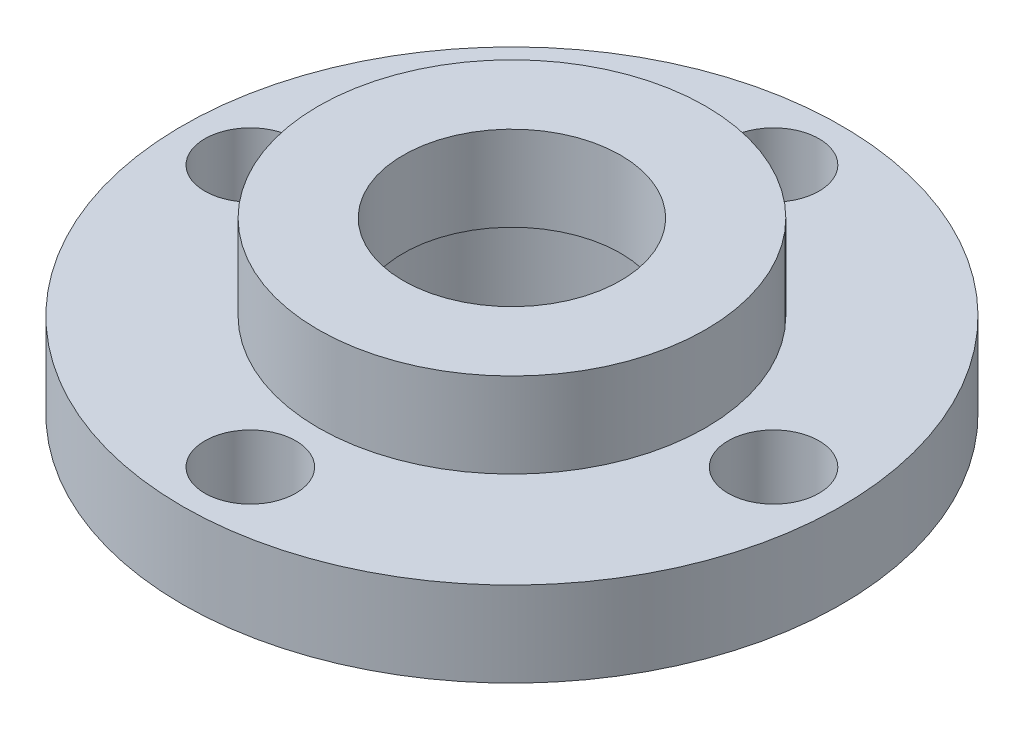
ISO-10303-21;
HEADER;
FILE_DESCRIPTION(('STEP AP214'),'2;1');
FILE_NAME('part.step','',(''),(''),'','','');
FILE_SCHEMA(('AUTOMOTIVE_DESIGN { 1 0 10303 214 1 1 1 1 }'));
ENDSEC;
DATA;
#1=APPLICATION_CONTEXT('core data for automotive mechanical design processes');
#2=APPLICATION_PROTOCOL_DEFINITION('international standard','automotive_design',2000,#1);
#3=PRODUCT_CONTEXT('',#1,'mechanical');
#4=PRODUCT('Part','Part','',(#3));
#5=PRODUCT_RELATED_PRODUCT_CATEGORY('part','',(#4));
#6=PRODUCT_DEFINITION_FORMATION('','',#4);
#7=PRODUCT_DEFINITION_CONTEXT('part definition',#1,'design');
#8=PRODUCT_DEFINITION('design','',#6,#7);
#9=PRODUCT_DEFINITION_SHAPE('','',#8);
#10=(LENGTH_UNIT() NAMED_UNIT(*) SI_UNIT(.MILLI.,.METRE.));
#11=(NAMED_UNIT(*) PLANE_ANGLE_UNIT() SI_UNIT($,.RADIAN.));
#12=(NAMED_UNIT(*) SI_UNIT($,.STERADIAN.) SOLID_ANGLE_UNIT());
#13=UNCERTAINTY_MEASURE_WITH_UNIT(LENGTH_MEASURE(1.E-05),#10,'distance_accuracy_value','');
#14=(GEOMETRIC_REPRESENTATION_CONTEXT(3) GLOBAL_UNCERTAINTY_ASSIGNED_CONTEXT((#13)) GLOBAL_UNIT_ASSIGNED_CONTEXT((#10,
#11,#12)) REPRESENTATION_CONTEXT('',''));
#15=CARTESIAN_POINT('',(0.,0.,0.));
#16=DIRECTION('',(0.,0.,1.));
#17=DIRECTION('',(1.,0.,0.));
#18=AXIS2_PLACEMENT_3D('',#15,#16,#17);
#19=CARTESIAN_POINT('',(0.,6.35,0.));
#20=DIRECTION('',(0.,-1.,0.));
#21=DIRECTION('',(0.,0.,-1.));
#22=AXIS2_PLACEMENT_3D('',#19,#20,#21);
#23=CYLINDRICAL_SURFACE('',#22,4.064);
#24=CARTESIAN_POINT('',(0.,6.35,0.));
#25=DIRECTION('',(0.,1.,0.));
#26=DIRECTION('',(0.,0.,1.));
#27=AXIS2_PLACEMENT_3D('',#24,#25,#26);
#28=CIRCLE('',#27,4.064);
#29=CARTESIAN_POINT('',(0.,6.35,4.064));
#30=VERTEX_POINT('',#29);
#31=EDGE_CURVE('E53',#30,#30,#28,.T.);
#32=ORIENTED_EDGE('',*,*,#31,.T.);
#33=EDGE_LOOP('',(#32));
#34=FACE_BOUND('',#33,.T.);
#35=CARTESIAN_POINT('',(0.,3.175,0.));
#36=DIRECTION('',(0.,-1.,0.));
#37=DIRECTION('',(0.,0.,-1.));
#38=AXIS2_PLACEMENT_3D('',#35,#36,#37);
#39=CIRCLE('',#38,4.064);
#40=CARTESIAN_POINT('',(0.,3.175,-4.064));
#41=VERTEX_POINT('',#40);
#42=EDGE_CURVE('E48',#41,#41,#39,.T.);
#43=ORIENTED_EDGE('',*,*,#42,.T.);
#44=EDGE_LOOP('',(#43));
#45=FACE_BOUND('',#44,.T.);
#46=ADVANCED_FACE('F45',(#34,#45),#23,.F.);
#47=CARTESIAN_POINT('',(0.,6.35,0.));
#48=DIRECTION('',(0.,-1.,0.));
#49=DIRECTION('',(0.,0.,-1.));
#50=AXIS2_PLACEMENT_3D('',#47,#48,#49);
#51=CYLINDRICAL_SURFACE('',#50,7.239);
#52=CARTESIAN_POINT('',(0.,3.175,0.));
#53=DIRECTION('',(0.,1.,0.));
#54=DIRECTION('',(0.,0.,1.));
#55=AXIS2_PLACEMENT_3D('',#52,#53,#54);
#56=CIRCLE('',#55,7.239);
#57=CARTESIAN_POINT('',(0.,3.175,7.239));
#58=VERTEX_POINT('',#57);
#59=EDGE_CURVE('E65',#58,#58,#56,.T.);
#60=ORIENTED_EDGE('',*,*,#59,.T.);
#61=EDGE_LOOP('',(#60));
#62=FACE_BOUND('',#61,.T.);
#63=CARTESIAN_POINT('',(0.,6.35,0.));
#64=DIRECTION('',(0.,1.,0.));
#65=DIRECTION('',(0.,0.,1.));
#66=AXIS2_PLACEMENT_3D('',#63,#64,#65);
#67=CIRCLE('',#66,7.239);
#68=CARTESIAN_POINT('',(0.,6.35,7.239));
#69=VERTEX_POINT('',#68);
#70=EDGE_CURVE('E10',#69,#69,#67,.T.);
#71=ORIENTED_EDGE('',*,*,#70,.F.);
#72=EDGE_LOOP('',(#71));
#73=FACE_BOUND('',#72,.T.);
#74=ADVANCED_FACE('F129',(#62,#73),#51,.T.);
#75=CARTESIAN_POINT('',(0.,6.35,0.));
#76=DIRECTION('',(0.,1.,0.));
#77=DIRECTION('',(0.,0.,1.));
#78=AXIS2_PLACEMENT_3D('',#75,#76,#77);
#79=PLANE('',#78);
#80=ORIENTED_EDGE('',*,*,#31,.F.);
#81=EDGE_LOOP('',(#80));
#82=FACE_BOUND('',#81,.T.);
#83=ORIENTED_EDGE('',*,*,#70,.T.);
#84=EDGE_LOOP('',(#83));
#85=FACE_BOUND('',#84,.T.);
#86=ADVANCED_FACE('F134',(#82,#85),#79,.T.);
#87=CARTESIAN_POINT('',(0.,0.,0.));
#88=DIRECTION('',(0.,1.,0.));
#89=DIRECTION('',(0.,0.,1.));
#90=AXIS2_PLACEMENT_3D('',#87,#88,#89);
#91=PLANE('',#90);
#92=CARTESIAN_POINT('',(0.,0.,0.));
#93=DIRECTION('',(0.,-1.,0.));
#94=DIRECTION('',(0.,0.,-1.));
#95=AXIS2_PLACEMENT_3D('',#92,#93,#94);
#96=CIRCLE('',#95,4.8895);
#97=CARTESIAN_POINT('',(0.,0.,-4.8895));
#98=VERTEX_POINT('',#97);
#99=EDGE_CURVE('E104',#98,#98,#96,.T.);
#100=ORIENTED_EDGE('',*,*,#99,.F.);
#101=EDGE_LOOP('',(#100));
#102=FACE_BOUND('',#101,.T.);
#103=CARTESIAN_POINT('',(0.,0.,-9.779));
#104=DIRECTION('',(0.,1.,0.));
#105=DIRECTION('',(0.,0.,1.));
#106=AXIS2_PLACEMENT_3D('',#103,#104,#105);
#107=CIRCLE('',#106,1.7);
#108=CARTESIAN_POINT('',(0.,0.,-8.079));
#109=VERTEX_POINT('',#108);
#110=EDGE_CURVE('E66',#109,#109,#107,.T.);
#111=ORIENTED_EDGE('',*,*,#110,.T.);
#112=EDGE_LOOP('',(#111));
#113=FACE_BOUND('',#112,.T.);
#114=CARTESIAN_POINT('',(9.779,0.,0.));
#115=DIRECTION('',(0.,1.,0.));
#116=DIRECTION('',(0.,0.,1.));
#117=AXIS2_PLACEMENT_3D('',#114,#115,#116);
#118=CIRCLE('',#117,1.7);
#119=CARTESIAN_POINT('',(9.779,0.,1.7));
#120=VERTEX_POINT('',#119);
#121=EDGE_CURVE('E89',#120,#120,#118,.T.);
#122=ORIENTED_EDGE('',*,*,#121,.T.);
#123=EDGE_LOOP('',(#122));
#124=FACE_BOUND('',#123,.T.);
#125=CARTESIAN_POINT('',(0.,0.,9.779));
#126=DIRECTION('',(0.,1.,0.));
#127=DIRECTION('',(0.,0.,1.));
#128=AXIS2_PLACEMENT_3D('',#125,#126,#127);
#129=CIRCLE('',#128,1.7);
#130=CARTESIAN_POINT('',(0.,0.,11.479));
#131=VERTEX_POINT('',#130);
#132=EDGE_CURVE('E81',#131,#131,#129,.T.);
#133=ORIENTED_EDGE('',*,*,#132,.T.);
#134=EDGE_LOOP('',(#133));
#135=FACE_BOUND('',#134,.T.);
#136=CARTESIAN_POINT('',(-9.779,0.,0.));
#137=DIRECTION('',(0.,1.,0.));
#138=DIRECTION('',(0.,0.,1.));
#139=AXIS2_PLACEMENT_3D('',#136,#137,#138);
#140=CIRCLE('',#139,1.7);
#141=CARTESIAN_POINT('',(-9.779,0.,1.7));
#142=VERTEX_POINT('',#141);
#143=EDGE_CURVE('E73',#142,#142,#140,.T.);
#144=ORIENTED_EDGE('',*,*,#143,.T.);
#145=EDGE_LOOP('',(#144));
#146=FACE_BOUND('',#145,.T.);
#147=CARTESIAN_POINT('',(0.,0.,0.));
#148=DIRECTION('',(0.,1.,0.));
#149=DIRECTION('',(0.,0.,1.));
#150=AXIS2_PLACEMENT_3D('',#147,#148,#149);
#151=CIRCLE('',#150,12.319);
#152=CARTESIAN_POINT('',(0.,0.,12.319));
#153=VERTEX_POINT('',#152);
#154=EDGE_CURVE('E61',#153,#153,#151,.T.);
#155=ORIENTED_EDGE('',*,*,#154,.F.);
#156=EDGE_LOOP('',(#155));
#157=FACE_BOUND('',#156,.T.);
#158=ADVANCED_FACE('F139',(#102,#113,#124,#135,#146,#157),#91,.F.);
#159=CARTESIAN_POINT('',(0.,3.175,0.));
#160=DIRECTION('',(0.,-1.,0.));
#161=DIRECTION('',(0.,0.,-1.));
#162=AXIS2_PLACEMENT_3D('',#159,#160,#161);
#163=CYLINDRICAL_SURFACE('',#162,12.319);
#164=CARTESIAN_POINT('',(0.,3.175,0.));
#165=DIRECTION('',(0.,1.,0.));
#166=DIRECTION('',(0.,0.,1.));
#167=AXIS2_PLACEMENT_3D('',#164,#165,#166);
#168=CIRCLE('',#167,12.319);
#169=CARTESIAN_POINT('',(0.,3.175,12.319));
#170=VERTEX_POINT('',#169);
#171=EDGE_CURVE('E58',#170,#170,#168,.T.);
#172=ORIENTED_EDGE('',*,*,#171,.F.);
#173=EDGE_LOOP('',(#172));
#174=FACE_BOUND('',#173,.T.);
#175=ORIENTED_EDGE('',*,*,#154,.T.);
#176=EDGE_LOOP('',(#175));
#177=FACE_BOUND('',#176,.T.);
#178=ADVANCED_FACE('F144',(#174,#177),#163,.T.);
#179=CARTESIAN_POINT('',(0.,3.175,0.));
#180=DIRECTION('',(0.,1.,0.));
#181=DIRECTION('',(0.,0.,1.));
#182=AXIS2_PLACEMENT_3D('',#179,#180,#181);
#183=PLANE('',#182);
#184=CARTESIAN_POINT('',(0.,3.175,-9.779));
#185=DIRECTION('',(0.,1.,0.));
#186=DIRECTION('',(0.,0.,1.));
#187=AXIS2_PLACEMENT_3D('',#184,#185,#186);
#188=CIRCLE('',#187,1.7);
#189=CARTESIAN_POINT('',(0.,3.175,-8.079));
#190=VERTEX_POINT('',#189);
#191=EDGE_CURVE('E97',#190,#190,#188,.T.);
#192=ORIENTED_EDGE('',*,*,#191,.F.);
#193=EDGE_LOOP('',(#192));
#194=FACE_BOUND('',#193,.T.);
#195=CARTESIAN_POINT('',(9.779,3.175,0.));
#196=DIRECTION('',(0.,1.,0.));
#197=DIRECTION('',(0.,0.,1.));
#198=AXIS2_PLACEMENT_3D('',#195,#196,#197);
#199=CIRCLE('',#198,1.7);
#200=CARTESIAN_POINT('',(9.779,3.175,1.7));
#201=VERTEX_POINT('',#200);
#202=EDGE_CURVE('E93',#201,#201,#199,.T.);
#203=ORIENTED_EDGE('',*,*,#202,.F.);
#204=EDGE_LOOP('',(#203));
#205=FACE_BOUND('',#204,.T.);
#206=CARTESIAN_POINT('',(0.,3.175,9.779));
#207=DIRECTION('',(0.,1.,0.));
#208=DIRECTION('',(0.,0.,1.));
#209=AXIS2_PLACEMENT_3D('',#206,#207,#208);
#210=CIRCLE('',#209,1.7);
#211=CARTESIAN_POINT('',(0.,3.175,11.479));
#212=VERTEX_POINT('',#211);
#213=EDGE_CURVE('E85',#212,#212,#210,.T.);
#214=ORIENTED_EDGE('',*,*,#213,.F.);
#215=EDGE_LOOP('',(#214));
#216=FACE_BOUND('',#215,.T.);
#217=CARTESIAN_POINT('',(-9.779,3.175,0.));
#218=DIRECTION('',(0.,1.,0.));
#219=DIRECTION('',(0.,0.,1.));
#220=AXIS2_PLACEMENT_3D('',#217,#218,#219);
#221=CIRCLE('',#220,1.7);
#222=CARTESIAN_POINT('',(-9.779,3.175,1.7));
#223=VERTEX_POINT('',#222);
#224=EDGE_CURVE('E77',#223,#223,#221,.T.);
#225=ORIENTED_EDGE('',*,*,#224,.F.);
#226=EDGE_LOOP('',(#225));
#227=FACE_BOUND('',#226,.T.);
#228=ORIENTED_EDGE('',*,*,#59,.F.);
#229=EDGE_LOOP('',(#228));
#230=FACE_BOUND('',#229,.T.);
#231=ORIENTED_EDGE('',*,*,#171,.T.);
#232=EDGE_LOOP('',(#231));
#233=FACE_BOUND('',#232,.T.);
#234=ADVANCED_FACE('F150',(#194,#205,#216,#227,#230,#233),#183,.T.);
#235=CARTESIAN_POINT('',(-9.779,0.,0.));
#236=DIRECTION('',(0.,1.,0.));
#237=DIRECTION('',(0.,0.,1.));
#238=AXIS2_PLACEMENT_3D('',#235,#236,#237);
#239=CYLINDRICAL_SURFACE('',#238,1.7);
#240=ORIENTED_EDGE('',*,*,#143,.F.);
#241=EDGE_LOOP('',(#240));
#242=FACE_BOUND('',#241,.T.);
#243=ORIENTED_EDGE('',*,*,#224,.T.);
#244=EDGE_LOOP('',(#243));
#245=FACE_BOUND('',#244,.T.);
#246=ADVANCED_FACE('F154',(#242,#245),#239,.F.);
#247=CARTESIAN_POINT('',(0.,0.,9.779));
#248=DIRECTION('',(0.,1.,0.));
#249=DIRECTION('',(0.,0.,1.));
#250=AXIS2_PLACEMENT_3D('',#247,#248,#249);
#251=CYLINDRICAL_SURFACE('',#250,1.7);
#252=ORIENTED_EDGE('',*,*,#132,.F.);
#253=EDGE_LOOP('',(#252));
#254=FACE_BOUND('',#253,.T.);
#255=ORIENTED_EDGE('',*,*,#213,.T.);
#256=EDGE_LOOP('',(#255));
#257=FACE_BOUND('',#256,.T.);
#258=ADVANCED_FACE('F158',(#254,#257),#251,.F.);
#259=CARTESIAN_POINT('',(9.779,0.,0.));
#260=DIRECTION('',(0.,1.,0.));
#261=DIRECTION('',(0.,0.,1.));
#262=AXIS2_PLACEMENT_3D('',#259,#260,#261);
#263=CYLINDRICAL_SURFACE('',#262,1.7);
#264=ORIENTED_EDGE('',*,*,#121,.F.);
#265=EDGE_LOOP('',(#264));
#266=FACE_BOUND('',#265,.T.);
#267=ORIENTED_EDGE('',*,*,#202,.T.);
#268=EDGE_LOOP('',(#267));
#269=FACE_BOUND('',#268,.T.);
#270=ADVANCED_FACE('F162',(#266,#269),#263,.F.);
#271=CARTESIAN_POINT('',(0.,0.,-9.779));
#272=DIRECTION('',(0.,1.,0.));
#273=DIRECTION('',(0.,0.,1.));
#274=AXIS2_PLACEMENT_3D('',#271,#272,#273);
#275=CYLINDRICAL_SURFACE('',#274,1.7);
#276=ORIENTED_EDGE('',*,*,#110,.F.);
#277=EDGE_LOOP('',(#276));
#278=FACE_BOUND('',#277,.T.);
#279=ORIENTED_EDGE('',*,*,#191,.T.);
#280=EDGE_LOOP('',(#279));
#281=FACE_BOUND('',#280,.T.);
#282=ADVANCED_FACE('F125',(#278,#281),#275,.F.);
#283=CARTESIAN_POINT('',(0.,3.175,0.));
#284=DIRECTION('',(0.,-1.,0.));
#285=DIRECTION('',(0.,0.,-1.));
#286=AXIS2_PLACEMENT_3D('',#283,#284,#285);
#287=CYLINDRICAL_SURFACE('',#286,4.8895);
#288=CARTESIAN_POINT('',(0.,3.175,0.));
#289=DIRECTION('',(0.,-1.,0.));
#290=DIRECTION('',(0.,0.,-1.));
#291=AXIS2_PLACEMENT_3D('',#288,#289,#290);
#292=CIRCLE('',#291,4.8895);
#293=CARTESIAN_POINT('',(0.,3.175,-4.8895));
#294=VERTEX_POINT('',#293);
#295=EDGE_CURVE('E108',#294,#294,#292,.T.);
#296=ORIENTED_EDGE('',*,*,#295,.F.);
#297=EDGE_LOOP('',(#296));
#298=FACE_BOUND('',#297,.T.);
#299=ORIENTED_EDGE('',*,*,#99,.T.);
#300=EDGE_LOOP('',(#299));
#301=FACE_BOUND('',#300,.T.);
#302=ADVANCED_FACE('F120',(#298,#301),#287,.F.);
#303=CARTESIAN_POINT('',(0.,3.175,0.));
#304=DIRECTION('',(0.,-1.,0.));
#305=DIRECTION('',(0.,0.,-1.));
#306=AXIS2_PLACEMENT_3D('',#303,#304,#305);
#307=PLANE('',#306);
#308=ORIENTED_EDGE('',*,*,#42,.F.);
#309=EDGE_LOOP('',(#308));
#310=FACE_BOUND('',#309,.T.);
#311=ORIENTED_EDGE('',*,*,#295,.T.);
#312=EDGE_LOOP('',(#311));
#313=FACE_BOUND('',#312,.T.);
#314=ADVANCED_FACE('F118',(#310,#313),#307,.T.);
#315=CLOSED_SHELL('',(#46,#74,#86,#158,#178,#234,#246,#258,#270,#282,#302,#314));
#316=MANIFOLD_SOLID_BREP('B2',#315);
#317=ADVANCED_BREP_SHAPE_REPRESENTATION('',(#18,#316),#14);
#318=SHAPE_DEFINITION_REPRESENTATION(#9,#317);
ENDSEC;
END-ISO-10303-21;
